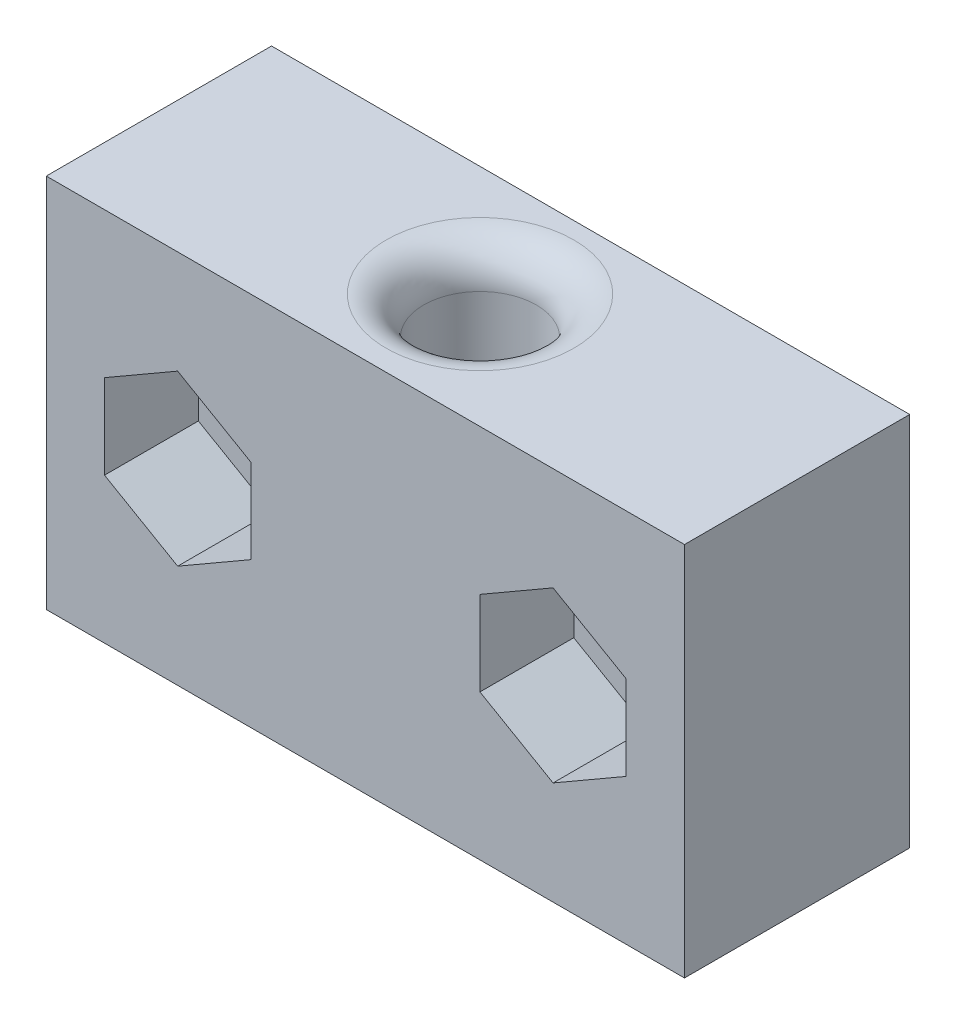
ISO-10303-21;
HEADER;
FILE_DESCRIPTION(('STEP AP214'),'2;1');
FILE_NAME('part.step','',(''),(''),'','','');
FILE_SCHEMA(('AUTOMOTIVE_DESIGN { 1 0 10303 214 1 1 1 1 }'));
ENDSEC;
DATA;
#1=APPLICATION_CONTEXT('core data for automotive mechanical design processes');
#2=APPLICATION_PROTOCOL_DEFINITION('international standard','automotive_design',2000,#1);
#3=PRODUCT_CONTEXT('',#1,'mechanical');
#4=PRODUCT('Part','Part','',(#3));
#5=PRODUCT_RELATED_PRODUCT_CATEGORY('part','',(#4));
#6=PRODUCT_DEFINITION_FORMATION('','',#4);
#7=PRODUCT_DEFINITION_CONTEXT('part definition',#1,'design');
#8=PRODUCT_DEFINITION('design','',#6,#7);
#9=PRODUCT_DEFINITION_SHAPE('','',#8);
#10=(LENGTH_UNIT() NAMED_UNIT(*) SI_UNIT(.MILLI.,.METRE.));
#11=(NAMED_UNIT(*) PLANE_ANGLE_UNIT() SI_UNIT($,.RADIAN.));
#12=(NAMED_UNIT(*) SI_UNIT($,.STERADIAN.) SOLID_ANGLE_UNIT());
#13=UNCERTAINTY_MEASURE_WITH_UNIT(LENGTH_MEASURE(1.E-05),#10,'distance_accuracy_value','');
#14=(GEOMETRIC_REPRESENTATION_CONTEXT(3) GLOBAL_UNCERTAINTY_ASSIGNED_CONTEXT((#13)) GLOBAL_UNIT_ASSIGNED_CONTEXT((#10,
#11,#12)) REPRESENTATION_CONTEXT('',''));
#15=CARTESIAN_POINT('',(0.,0.,0.));
#16=DIRECTION('',(0.,0.,1.));
#17=DIRECTION('',(1.,0.,0.));
#18=AXIS2_PLACEMENT_3D('',#15,#16,#17);
#19=CARTESIAN_POINT('',(9.99999999999315,0.,19.0710678118655));
#20=DIRECTION('',(0.,0.,-1.));
#21=DIRECTION('',(-1.,0.,0.));
#22=AXIS2_PLACEMENT_3D('',#19,#20,#21);
#23=CYLINDRICAL_SURFACE('',#22,2.5);
#24=CARTESIAN_POINT('',(9.99999999999315,0.,2.));
#25=DIRECTION('',(0.,0.,-1.));
#26=DIRECTION('',(-1.,0.,0.));
#27=AXIS2_PLACEMENT_3D('',#24,#25,#26);
#28=CIRCLE('',#27,2.5);
#29=CARTESIAN_POINT('',(7.49999999999315,0.,2.));
#30=VERTEX_POINT('',#29);
#31=EDGE_CURVE('E262',#30,#30,#28,.T.);
#32=ORIENTED_EDGE('',*,*,#31,.T.);
#33=EDGE_LOOP('',(#32));
#34=FACE_BOUND('',#33,.T.);
#35=CARTESIAN_POINT('',(9.99999999999315,0.,7.));
#36=DIRECTION('',(0.,0.,1.));
#37=DIRECTION('',(1.,0.,0.));
#38=AXIS2_PLACEMENT_3D('',#35,#36,#37);
#39=CIRCLE('',#38,2.5);
#40=CARTESIAN_POINT('',(12.4999999999931,0.,7.));
#41=VERTEX_POINT('',#40);
#42=EDGE_CURVE('E38',#41,#41,#39,.F.);
#43=ORIENTED_EDGE('',*,*,#42,.F.);
#44=EDGE_LOOP('',(#43));
#45=FACE_BOUND('',#44,.T.);
#46=ADVANCED_FACE('F34',(#34,#45),#23,.F.);
#47=CARTESIAN_POINT('',(-10.,0.,19.0710678118655));
#48=DIRECTION('',(0.,0.,-1.));
#49=DIRECTION('',(-1.,0.,0.));
#50=AXIS2_PLACEMENT_3D('',#47,#48,#49);
#51=CYLINDRICAL_SURFACE('',#50,2.5);
#52=CARTESIAN_POINT('',(-10.,0.,2.));
#53=DIRECTION('',(0.,0.,-1.));
#54=DIRECTION('',(-1.,0.,0.));
#55=AXIS2_PLACEMENT_3D('',#52,#53,#54);
#56=CIRCLE('',#55,2.5);
#57=CARTESIAN_POINT('',(-12.5,0.,2.));
#58=VERTEX_POINT('',#57);
#59=EDGE_CURVE('E251',#58,#58,#56,.T.);
#60=ORIENTED_EDGE('',*,*,#59,.T.);
#61=EDGE_LOOP('',(#60));
#62=FACE_BOUND('',#61,.T.);
#63=CARTESIAN_POINT('',(-10.,0.,7.));
#64=DIRECTION('',(0.,0.,1.));
#65=DIRECTION('',(1.,0.,0.));
#66=AXIS2_PLACEMENT_3D('',#63,#64,#65);
#67=CIRCLE('',#66,2.5);
#68=CARTESIAN_POINT('',(-7.50000000000001,0.,7.));
#69=VERTEX_POINT('',#68);
#70=EDGE_CURVE('E198',#69,#69,#67,.F.);
#71=ORIENTED_EDGE('',*,*,#70,.F.);
#72=EDGE_LOOP('',(#71));
#73=FACE_BOUND('',#72,.T.);
#74=ADVANCED_FACE('F314',(#62,#73),#51,.F.);
#75=CARTESIAN_POINT('',(17.,-10.,12.));
#76=DIRECTION('',(-1.,0.,0.));
#77=DIRECTION('',(0.,0.,1.));
#78=AXIS2_PLACEMENT_3D('',#75,#76,#77);
#79=PLANE('',#78);
#80=DIRECTION('',(0.,1.,0.));
#81=VECTOR('',#80,1.);
#82=CARTESIAN_POINT('',(17.,-10.,0.));
#83=LINE('',#82,#81);
#84=CARTESIAN_POINT('',(17.,-10.,0.));
#85=VERTEX_POINT('',#84);
#86=CARTESIAN_POINT('',(17.,10.,0.));
#87=VERTEX_POINT('',#86);
#88=EDGE_CURVE('E259',#85,#87,#83,.T.);
#89=ORIENTED_EDGE('',*,*,#88,.T.);
#90=DIRECTION('',(0.,0.,-1.));
#91=VECTOR('',#90,1.);
#92=CARTESIAN_POINT('',(17.,10.,12.));
#93=LINE('',#92,#91);
#94=CARTESIAN_POINT('',(17.,10.,12.));
#95=VERTEX_POINT('',#94);
#96=EDGE_CURVE('E296',#95,#87,#93,.T.);
#97=ORIENTED_EDGE('',*,*,#96,.F.);
#98=DIRECTION('',(0.,1.,0.));
#99=VECTOR('',#98,1.);
#100=CARTESIAN_POINT('',(17.,-10.,12.));
#101=LINE('',#100,#99);
#102=CARTESIAN_POINT('',(17.,-10.,12.));
#103=VERTEX_POINT('',#102);
#104=EDGE_CURVE('E270',#103,#95,#101,.T.);
#105=ORIENTED_EDGE('',*,*,#104,.F.);
#106=DIRECTION('',(0.,0.,-1.));
#107=VECTOR('',#106,1.);
#108=CARTESIAN_POINT('',(17.,-10.,12.));
#109=LINE('',#108,#107);
#110=EDGE_CURVE('E280',#103,#85,#109,.T.);
#111=ORIENTED_EDGE('',*,*,#110,.T.);
#112=EDGE_LOOP('',(#89,#97,#105,#111));
#113=FACE_BOUND('',#112,.T.);
#114=ADVANCED_FACE('F320',(#113),#79,.F.);
#115=CARTESIAN_POINT('',(-17.,10.,12.));
#116=DIRECTION('',(0.,-1.,0.));
#117=DIRECTION('',(0.,0.,-1.));
#118=AXIS2_PLACEMENT_3D('',#115,#116,#117);
#119=PLANE('',#118);
#120=CARTESIAN_POINT('',(0.,10.,5.89249929619027));
#121=DIRECTION('',(0.,-1.,0.));
#122=DIRECTION('',(0.,0.,-1.));
#123=AXIS2_PLACEMENT_3D('',#120,#121,#122);
#124=CIRCLE('',#123,5.);
#125=CARTESIAN_POINT('',(0.,10.,0.892499296190275));
#126=VERTEX_POINT('',#125);
#127=EDGE_CURVE('E43',#126,#126,#124,.T.);
#128=ORIENTED_EDGE('',*,*,#127,.T.);
#129=EDGE_LOOP('',(#128));
#130=FACE_BOUND('',#129,.T.);
#131=DIRECTION('',(-1.,0.,0.));
#132=VECTOR('',#131,1.);
#133=CARTESIAN_POINT('',(-17.,10.,0.));
#134=LINE('',#133,#132);
#135=CARTESIAN_POINT('',(-17.,10.,0.));
#136=VERTEX_POINT('',#135);
#137=EDGE_CURVE('E283',#87,#136,#134,.T.);
#138=ORIENTED_EDGE('',*,*,#137,.T.);
#139=DIRECTION('',(0.,0.,-1.));
#140=VECTOR('',#139,1.);
#141=CARTESIAN_POINT('',(-17.,10.,12.));
#142=LINE('',#141,#140);
#143=CARTESIAN_POINT('',(-17.,10.,12.));
#144=VERTEX_POINT('',#143);
#145=EDGE_CURVE('E293',#144,#136,#142,.T.);
#146=ORIENTED_EDGE('',*,*,#145,.F.);
#147=DIRECTION('',(-1.,0.,0.));
#148=VECTOR('',#147,1.);
#149=CARTESIAN_POINT('',(-17.,10.,12.));
#150=LINE('',#149,#148);
#151=EDGE_CURVE('E273',#95,#144,#150,.T.);
#152=ORIENTED_EDGE('',*,*,#151,.F.);
#153=ORIENTED_EDGE('',*,*,#96,.T.);
#154=EDGE_LOOP('',(#138,#146,#152,#153));
#155=FACE_BOUND('',#154,.T.);
#156=ADVANCED_FACE('F341',(#130,#155),#119,.F.);
#157=CARTESIAN_POINT('',(-17.,-10.,12.));
#158=DIRECTION('',(1.,0.,0.));
#159=DIRECTION('',(0.,0.,-1.));
#160=AXIS2_PLACEMENT_3D('',#157,#158,#159);
#161=PLANE('',#160);
#162=DIRECTION('',(0.,-1.,0.));
#163=VECTOR('',#162,1.);
#164=CARTESIAN_POINT('',(-17.,-10.,0.));
#165=LINE('',#164,#163);
#166=CARTESIAN_POINT('',(-17.,-10.,0.));
#167=VERTEX_POINT('',#166);
#168=EDGE_CURVE('E285',#136,#167,#165,.T.);
#169=ORIENTED_EDGE('',*,*,#168,.T.);
#170=DIRECTION('',(0.,0.,-1.));
#171=VECTOR('',#170,1.);
#172=CARTESIAN_POINT('',(-17.,-10.,12.));
#173=LINE('',#172,#171);
#174=CARTESIAN_POINT('',(-17.,-10.,12.));
#175=VERTEX_POINT('',#174);
#176=EDGE_CURVE('E290',#175,#167,#173,.T.);
#177=ORIENTED_EDGE('',*,*,#176,.F.);
#178=DIRECTION('',(0.,-1.,0.));
#179=VECTOR('',#178,1.);
#180=CARTESIAN_POINT('',(-17.,-10.,12.));
#181=LINE('',#180,#179);
#182=EDGE_CURVE('E276',#144,#175,#181,.T.);
#183=ORIENTED_EDGE('',*,*,#182,.F.);
#184=ORIENTED_EDGE('',*,*,#145,.T.);
#185=EDGE_LOOP('',(#169,#177,#183,#184));
#186=FACE_BOUND('',#185,.T.);
#187=ADVANCED_FACE('F337',(#186),#161,.F.);
#188=CARTESIAN_POINT('',(-17.,-10.,12.));
#189=DIRECTION('',(0.,1.,0.));
#190=DIRECTION('',(0.,0.,1.));
#191=AXIS2_PLACEMENT_3D('',#188,#189,#190);
#192=PLANE('',#191);
#193=CARTESIAN_POINT('',(0.,-10.,5.89249929619027));
#194=DIRECTION('',(0.,1.,0.));
#195=DIRECTION('',(0.,0.,1.));
#196=AXIS2_PLACEMENT_3D('',#193,#194,#195);
#197=CIRCLE('',#196,5.);
#198=CARTESIAN_POINT('',(0.,-10.,10.8924992961903));
#199=VERTEX_POINT('',#198);
#200=EDGE_CURVE('E11',#199,#199,#197,.T.);
#201=ORIENTED_EDGE('',*,*,#200,.T.);
#202=EDGE_LOOP('',(#201));
#203=FACE_BOUND('',#202,.T.);
#204=DIRECTION('',(1.,0.,0.));
#205=VECTOR('',#204,1.);
#206=CARTESIAN_POINT('',(-17.,-10.,0.));
#207=LINE('',#206,#205);
#208=EDGE_CURVE('E274',#167,#85,#207,.T.);
#209=ORIENTED_EDGE('',*,*,#208,.T.);
#210=ORIENTED_EDGE('',*,*,#110,.F.);
#211=DIRECTION('',(1.,0.,0.));
#212=VECTOR('',#211,1.);
#213=CARTESIAN_POINT('',(-17.,-10.,12.));
#214=LINE('',#213,#212);
#215=EDGE_CURVE('E278',#175,#103,#214,.T.);
#216=ORIENTED_EDGE('',*,*,#215,.F.);
#217=ORIENTED_EDGE('',*,*,#176,.T.);
#218=EDGE_LOOP('',(#209,#210,#216,#217));
#219=FACE_BOUND('',#218,.T.);
#220=ADVANCED_FACE('F329',(#203,#219),#192,.F.);
#221=CARTESIAN_POINT('',(0.,0.,12.));
#222=DIRECTION('',(0.,0.,-1.));
#223=DIRECTION('',(-1.,0.,0.));
#224=AXIS2_PLACEMENT_3D('',#221,#222,#223);
#225=PLANE('',#224);
#226=DIRECTION('',(-0.866025403784439,-0.5,0.));
#227=VECTOR('',#226,1.);
#228=CARTESIAN_POINT('',(-10.,4.5,12.));
#229=LINE('',#228,#227);
#230=CARTESIAN_POINT('',(-10.,4.5,12.));
#231=VERTEX_POINT('',#230);
#232=CARTESIAN_POINT('',(-13.89711431703,2.25,12.));
#233=VERTEX_POINT('',#232);
#234=EDGE_CURVE('E185',#231,#233,#229,.T.);
#235=ORIENTED_EDGE('',*,*,#234,.F.);
#236=DIRECTION('',(-0.866025403784439,0.5,0.));
#237=VECTOR('',#236,1.);
#238=CARTESIAN_POINT('',(-6.10288568297003,2.25,12.));
#239=LINE('',#238,#237);
#240=CARTESIAN_POINT('',(-6.10288568297003,2.25,12.));
#241=VERTEX_POINT('',#240);
#242=EDGE_CURVE('E51',#241,#231,#239,.T.);
#243=ORIENTED_EDGE('',*,*,#242,.F.);
#244=DIRECTION('',(0.,1.,0.));
#245=VECTOR('',#244,1.);
#246=CARTESIAN_POINT('',(-6.10288568297003,-2.25,12.));
#247=LINE('',#246,#245);
#248=CARTESIAN_POINT('',(-6.10288568297003,-2.25,12.));
#249=VERTEX_POINT('',#248);
#250=EDGE_CURVE('E171',#249,#241,#247,.T.);
#251=ORIENTED_EDGE('',*,*,#250,.F.);
#252=DIRECTION('',(0.866025403784438,0.5,0.));
#253=VECTOR('',#252,1.);
#254=CARTESIAN_POINT('',(-10.,-4.5,12.));
#255=LINE('',#254,#253);
#256=CARTESIAN_POINT('',(-10.,-4.5,12.));
#257=VERTEX_POINT('',#256);
#258=EDGE_CURVE('E174',#257,#249,#255,.T.);
#259=ORIENTED_EDGE('',*,*,#258,.F.);
#260=DIRECTION('',(0.866025403784439,-0.5,0.));
#261=VECTOR('',#260,1.);
#262=CARTESIAN_POINT('',(-13.89711431703,-2.25,12.));
#263=LINE('',#262,#261);
#264=CARTESIAN_POINT('',(-13.89711431703,-2.25,12.));
#265=VERTEX_POINT('',#264);
#266=EDGE_CURVE('E191',#265,#257,#263,.T.);
#267=ORIENTED_EDGE('',*,*,#266,.F.);
#268=DIRECTION('',(0.,-1.,0.));
#269=VECTOR('',#268,1.);
#270=CARTESIAN_POINT('',(-13.89711431703,2.25,12.));
#271=LINE('',#270,#269);
#272=EDGE_CURVE('E188',#233,#265,#271,.T.);
#273=ORIENTED_EDGE('',*,*,#272,.F.);
#274=EDGE_LOOP('',(#235,#243,#251,#259,#267,#273));
#275=FACE_BOUND('',#274,.T.);
#276=DIRECTION('',(-0.866025403784438,-0.500000000000001,0.));
#277=VECTOR('',#276,1.);
#278=CARTESIAN_POINT('',(9.99999999999315,4.5,12.));
#279=LINE('',#278,#277);
#280=CARTESIAN_POINT('',(9.99999999999315,4.5,12.));
#281=VERTEX_POINT('',#280);
#282=CARTESIAN_POINT('',(6.10288568296317,2.24999999999999,12.));
#283=VERTEX_POINT('',#282);
#284=EDGE_CURVE('E227',#281,#283,#279,.T.);
#285=ORIENTED_EDGE('',*,*,#284,.F.);
#286=DIRECTION('',(-0.866025403784441,0.499999999999995,0.));
#287=VECTOR('',#286,1.);
#288=CARTESIAN_POINT('',(13.8971143170231,2.25000000000004,12.));
#289=LINE('',#288,#287);
#290=CARTESIAN_POINT('',(13.8971143170231,2.25000000000004,12.));
#291=VERTEX_POINT('',#290);
#292=EDGE_CURVE('E59',#291,#281,#289,.T.);
#293=ORIENTED_EDGE('',*,*,#292,.F.);
#294=DIRECTION('',(0.,1.,0.));
#295=VECTOR('',#294,1.);
#296=CARTESIAN_POINT('',(13.8971143170231,-2.24999999999996,12.));
#297=LINE('',#296,#295);
#298=CARTESIAN_POINT('',(13.8971143170231,-2.24999999999996,12.));
#299=VERTEX_POINT('',#298);
#300=EDGE_CURVE('E210',#299,#291,#297,.T.);
#301=ORIENTED_EDGE('',*,*,#300,.F.);
#302=DIRECTION('',(0.866025403784435,0.500000000000007,0.));
#303=VECTOR('',#302,1.);
#304=CARTESIAN_POINT('',(9.99999999999318,-4.5,12.));
#305=LINE('',#304,#303);
#306=CARTESIAN_POINT('',(9.99999999999318,-4.5,12.));
#307=VERTEX_POINT('',#306);
#308=EDGE_CURVE('E236',#307,#299,#305,.T.);
#309=ORIENTED_EDGE('',*,*,#308,.F.);
#310=DIRECTION('',(0.866025403784442,-0.499999999999995,0.));
#311=VECTOR('',#310,1.);
#312=CARTESIAN_POINT('',(6.10288568296318,-2.25000000000002,12.));
#313=LINE('',#312,#311);
#314=CARTESIAN_POINT('',(6.10288568296318,-2.25000000000002,12.));
#315=VERTEX_POINT('',#314);
#316=EDGE_CURVE('E233',#315,#307,#313,.T.);
#317=ORIENTED_EDGE('',*,*,#316,.F.);
#318=DIRECTION('',(0.,-1.,0.));
#319=VECTOR('',#318,1.);
#320=CARTESIAN_POINT('',(6.10288568296317,2.24999999999999,12.));
#321=LINE('',#320,#319);
#322=EDGE_CURVE('E230',#283,#315,#321,.T.);
#323=ORIENTED_EDGE('',*,*,#322,.F.);
#324=EDGE_LOOP('',(#285,#293,#301,#309,#317,#323));
#325=FACE_BOUND('',#324,.T.);
#326=ORIENTED_EDGE('',*,*,#104,.T.);
#327=ORIENTED_EDGE('',*,*,#151,.T.);
#328=ORIENTED_EDGE('',*,*,#182,.T.);
#329=ORIENTED_EDGE('',*,*,#215,.T.);
#330=EDGE_LOOP('',(#326,#327,#328,#329));
#331=FACE_BOUND('',#330,.T.);
#332=ADVANCED_FACE('F325',(#275,#325,#331),#225,.F.);
#333=CARTESIAN_POINT('',(0.,0.,0.));
#334=DIRECTION('',(0.,0.,-1.));
#335=DIRECTION('',(-1.,0.,0.));
#336=AXIS2_PLACEMENT_3D('',#333,#334,#335);
#337=PLANE('',#336);
#338=CARTESIAN_POINT('',(-10.,0.,0.));
#339=DIRECTION('',(0.,0.,-1.));
#340=DIRECTION('',(-1.,0.,0.));
#341=AXIS2_PLACEMENT_3D('',#338,#339,#340);
#342=CIRCLE('',#341,4.3);
#343=CARTESIAN_POINT('',(-14.3,0.,0.));
#344=VERTEX_POINT('',#343);
#345=EDGE_CURVE('E254',#344,#344,#342,.T.);
#346=ORIENTED_EDGE('',*,*,#345,.F.);
#347=EDGE_LOOP('',(#346));
#348=FACE_BOUND('',#347,.T.);
#349=CARTESIAN_POINT('',(9.99999999999315,0.,0.));
#350=DIRECTION('',(0.,0.,-1.));
#351=DIRECTION('',(-1.,0.,0.));
#352=AXIS2_PLACEMENT_3D('',#349,#350,#351);
#353=CIRCLE('',#352,4.3);
#354=CARTESIAN_POINT('',(5.69999999999315,0.,0.));
#355=VERTEX_POINT('',#354);
#356=EDGE_CURVE('E265',#355,#355,#353,.T.);
#357=ORIENTED_EDGE('',*,*,#356,.F.);
#358=EDGE_LOOP('',(#357));
#359=FACE_BOUND('',#358,.T.);
#360=ORIENTED_EDGE('',*,*,#88,.F.);
#361=ORIENTED_EDGE('',*,*,#208,.F.);
#362=ORIENTED_EDGE('',*,*,#168,.F.);
#363=ORIENTED_EDGE('',*,*,#137,.F.);
#364=EDGE_LOOP('',(#360,#361,#362,#363));
#365=FACE_BOUND('',#364,.T.);
#366=ADVANCED_FACE('F328',(#348,#359,#365),#337,.T.);
#367=CARTESIAN_POINT('',(-10.,0.,2.));
#368=DIRECTION('',(0.,0.,-1.));
#369=DIRECTION('',(-1.,0.,0.));
#370=AXIS2_PLACEMENT_3D('',#367,#368,#369);
#371=CYLINDRICAL_SURFACE('',#370,4.3);
#372=CARTESIAN_POINT('',(-10.,0.,2.));
#373=DIRECTION('',(0.,0.,-1.));
#374=DIRECTION('',(-1.,0.,0.));
#375=AXIS2_PLACEMENT_3D('',#372,#373,#374);
#376=CIRCLE('',#375,4.3);
#377=CARTESIAN_POINT('',(-14.3,0.,2.));
#378=VERTEX_POINT('',#377);
#379=EDGE_CURVE('E256',#378,#378,#376,.T.);
#380=ORIENTED_EDGE('',*,*,#379,.F.);
#381=EDGE_LOOP('',(#380));
#382=FACE_BOUND('',#381,.T.);
#383=ORIENTED_EDGE('',*,*,#345,.T.);
#384=EDGE_LOOP('',(#383));
#385=FACE_BOUND('',#384,.T.);
#386=ADVANCED_FACE('F333',(#382,#385),#371,.F.);
#387=CARTESIAN_POINT('',(-10.,0.,2.));
#388=DIRECTION('',(0.,0.,-1.));
#389=DIRECTION('',(-1.,0.,0.));
#390=AXIS2_PLACEMENT_3D('',#387,#388,#389);
#391=PLANE('',#390);
#392=ORIENTED_EDGE('',*,*,#59,.F.);
#393=EDGE_LOOP('',(#392));
#394=FACE_BOUND('',#393,.T.);
#395=ORIENTED_EDGE('',*,*,#379,.T.);
#396=EDGE_LOOP('',(#395));
#397=FACE_BOUND('',#396,.T.);
#398=ADVANCED_FACE('F390',(#394,#397),#391,.T.);
#399=CARTESIAN_POINT('',(9.99999999999315,0.,2.));
#400=DIRECTION('',(0.,0.,-1.));
#401=DIRECTION('',(-1.,0.,0.));
#402=AXIS2_PLACEMENT_3D('',#399,#400,#401);
#403=CYLINDRICAL_SURFACE('',#402,4.3);
#404=CARTESIAN_POINT('',(9.99999999999315,0.,2.));
#405=DIRECTION('',(0.,0.,-1.));
#406=DIRECTION('',(-1.,0.,0.));
#407=AXIS2_PLACEMENT_3D('',#404,#405,#406);
#408=CIRCLE('',#407,4.3);
#409=CARTESIAN_POINT('',(5.69999999999315,0.,2.));
#410=VERTEX_POINT('',#409);
#411=EDGE_CURVE('E255',#410,#410,#408,.T.);
#412=ORIENTED_EDGE('',*,*,#411,.F.);
#413=EDGE_LOOP('',(#412));
#414=FACE_BOUND('',#413,.T.);
#415=ORIENTED_EDGE('',*,*,#356,.T.);
#416=EDGE_LOOP('',(#415));
#417=FACE_BOUND('',#416,.T.);
#418=ADVANCED_FACE('F383',(#414,#417),#403,.F.);
#419=CARTESIAN_POINT('',(9.99999999999315,0.,2.));
#420=DIRECTION('',(0.,0.,-1.));
#421=DIRECTION('',(-1.,0.,0.));
#422=AXIS2_PLACEMENT_3D('',#419,#420,#421);
#423=PLANE('',#422);
#424=ORIENTED_EDGE('',*,*,#31,.F.);
#425=EDGE_LOOP('',(#424));
#426=FACE_BOUND('',#425,.T.);
#427=ORIENTED_EDGE('',*,*,#411,.T.);
#428=EDGE_LOOP('',(#427));
#429=FACE_BOUND('',#428,.T.);
#430=ADVANCED_FACE('F357',(#426,#429),#423,.T.);
#431=CARTESIAN_POINT('',(0.,-18.4852813742386,5.89249929619027));
#432=DIRECTION('',(0.,1.,0.));
#433=DIRECTION('',(0.,0.,1.));
#434=AXIS2_PLACEMENT_3D('',#431,#432,#433);
#435=CYLINDRICAL_SURFACE('',#434,3.);
#436=CARTESIAN_POINT('',(0.,8.,5.89249929619027));
#437=DIRECTION('',(0.,-1.,0.));
#438=DIRECTION('',(0.,0.,-1.));
#439=AXIS2_PLACEMENT_3D('',#436,#437,#438);
#440=CIRCLE('',#439,3.);
#441=CARTESIAN_POINT('',(0.,8.,8.89249929619027));
#442=VERTEX_POINT('',#441);
#443=EDGE_CURVE('E302',#442,#442,#440,.F.);
#444=CARTESIAN_POINT('',(0.,-8.,5.89249929619027));
#445=DIRECTION('',(0.,1.,0.));
#446=DIRECTION('',(0.,0.,1.));
#447=AXIS2_PLACEMENT_3D('',#444,#445,#446);
#448=CIRCLE('',#447,3.);
#449=CARTESIAN_POINT('',(0.,-8.,8.89249929619027));
#450=VERTEX_POINT('',#449);
#451=EDGE_CURVE('E299',#450,#450,#448,.F.);
#452=CARTESIAN_POINT('',(0.,8.,8.89249929619027));
#453=CARTESIAN_POINT('',(0.,7.83333333333333,8.89249929619027));
#454=CARTESIAN_POINT('',(0.,7.66666666666666,8.89249929619027));
#455=CARTESIAN_POINT('',(0.,7.33333333333333,8.89249929619027));
#456=CARTESIAN_POINT('',(0.,7.16666666666666,8.89249929619027));
#457=CARTESIAN_POINT('',(0.,6.83333333333333,8.89249929619027));
#458=CARTESIAN_POINT('',(0.,6.66666666666666,8.89249929619027));
#459=CARTESIAN_POINT('',(0.,6.33333333333333,8.89249929619027));
#460=CARTESIAN_POINT('',(0.,6.16666666666666,8.89249929619027));
#461=CARTESIAN_POINT('',(0.,5.83333333333333,8.89249929619027));
#462=CARTESIAN_POINT('',(0.,5.66666666666666,8.89249929619027));
#463=CARTESIAN_POINT('',(0.,5.33333333333333,8.89249929619027));
#464=CARTESIAN_POINT('',(0.,5.16666666666666,8.89249929619027));
#465=CARTESIAN_POINT('',(0.,4.83333333333333,8.89249929619027));
#466=CARTESIAN_POINT('',(0.,4.66666666666666,8.89249929619027));
#467=CARTESIAN_POINT('',(0.,4.33333333333333,8.89249929619027));
#468=CARTESIAN_POINT('',(0.,4.16666666666666,8.89249929619027));
#469=CARTESIAN_POINT('',(0.,3.83333333333333,8.89249929619027));
#470=CARTESIAN_POINT('',(0.,3.66666666666666,8.89249929619027));
#471=CARTESIAN_POINT('',(0.,3.33333333333333,8.89249929619027));
#472=CARTESIAN_POINT('',(0.,3.16666666666666,8.89249929619027));
#473=CARTESIAN_POINT('',(0.,2.83333333333333,8.89249929619027));
#474=CARTESIAN_POINT('',(0.,2.66666666666666,8.89249929619027));
#475=CARTESIAN_POINT('',(0.,2.33333333333333,8.89249929619027));
#476=CARTESIAN_POINT('',(0.,2.16666666666667,8.89249929619027));
#477=CARTESIAN_POINT('',(0.,1.83333333333333,8.89249929619027));
#478=CARTESIAN_POINT('',(0.,1.66666666666666,8.89249929619027));
#479=CARTESIAN_POINT('',(0.,1.33333333333333,8.89249929619027));
#480=CARTESIAN_POINT('',(0.,1.16666666666666,8.89249929619027));
#481=CARTESIAN_POINT('',(0.,0.833333333333331,8.89249929619027));
#482=CARTESIAN_POINT('',(0.,0.666666666666664,8.89249929619027));
#483=CARTESIAN_POINT('',(0.,0.33333333333333,8.89249929619027));
#484=CARTESIAN_POINT('',(0.,0.166666666666663,8.89249929619027));
#485=CARTESIAN_POINT('',(0.,-0.16666666666667,8.89249929619027));
#486=CARTESIAN_POINT('',(0.,-0.333333333333337,8.89249929619027));
#487=CARTESIAN_POINT('',(0.,-0.666666666666671,8.89249929619027));
#488=CARTESIAN_POINT('',(0.,-0.833333333333338,8.89249929619027));
#489=CARTESIAN_POINT('',(0.,-1.16666666666667,8.89249929619027));
#490=CARTESIAN_POINT('',(0.,-1.33333333333334,8.89249929619027));
#491=CARTESIAN_POINT('',(0.,-1.66666666666667,8.89249929619027));
#492=CARTESIAN_POINT('',(0.,-1.83333333333334,8.89249929619027));
#493=CARTESIAN_POINT('',(0.,-2.16666666666667,8.89249929619027));
#494=CARTESIAN_POINT('',(0.,-2.33333333333334,8.89249929619027));
#495=CARTESIAN_POINT('',(0.,-2.66666666666667,8.89249929619027));
#496=CARTESIAN_POINT('',(0.,-2.83333333333334,8.89249929619027));
#497=CARTESIAN_POINT('',(0.,-3.16666666666667,8.89249929619027));
#498=CARTESIAN_POINT('',(0.,-3.33333333333333,8.89249929619027));
#499=CARTESIAN_POINT('',(0.,-3.66666666666667,8.89249929619027));
#500=CARTESIAN_POINT('',(0.,-3.83333333333333,8.89249929619027));
#501=CARTESIAN_POINT('',(0.,-4.16666666666667,8.89249929619027));
#502=CARTESIAN_POINT('',(0.,-4.33333333333334,8.89249929619027));
#503=CARTESIAN_POINT('',(0.,-4.66666666666667,8.89249929619027));
#504=CARTESIAN_POINT('',(0.,-4.83333333333334,8.89249929619027));
#505=CARTESIAN_POINT('',(0.,-5.16666666666667,8.89249929619027));
#506=CARTESIAN_POINT('',(0.,-5.33333333333333,8.89249929619027));
#507=CARTESIAN_POINT('',(0.,-5.66666666666667,8.89249929619027));
#508=CARTESIAN_POINT('',(0.,-5.83333333333334,8.89249929619027));
#509=CARTESIAN_POINT('',(0.,-6.16666666666667,8.89249929619027));
#510=CARTESIAN_POINT('',(0.,-6.33333333333334,8.89249929619027));
#511=CARTESIAN_POINT('',(0.,-6.66666666666667,8.89249929619027));
#512=CARTESIAN_POINT('',(0.,-6.83333333333333,8.89249929619027));
#513=CARTESIAN_POINT('',(0.,-7.16666666666667,8.89249929619027));
#514=CARTESIAN_POINT('',(0.,-7.33333333333333,8.89249929619027));
#515=CARTESIAN_POINT('',(0.,-7.66666666666667,8.89249929619027));
#516=CARTESIAN_POINT('',(0.,-7.83333333333333,8.89249929619027));
#517=CARTESIAN_POINT('',(0.,-8.,8.89249929619027));
#518=B_SPLINE_CURVE_WITH_KNOTS('',3,(#452,#453,#454,#455,#456,#457,#458,#459,#460,#461,#462,
#463,#464,#465,#466,#467,#468,#469,#470,#471,#472,#473,#474,#475,#476,#477,#478,#479,#480,#481,
#482,#483,#484,#485,#486,#487,#488,#489,#490,#491,#492,#493,#494,#495,#496,#497,#498,#499,#500,
#501,#502,#503,#504,#505,#506,#507,#508,#509,#510,#511,#512,#513,#514,#515,#516,#517),
.UNSPECIFIED.,.F.,.F.,(4,2,2,2,2,2,2,2,2,2,2,2,2,2,2,2,2,2,2,2,2,2,2,2,2,2,2,2,2,2,2,2,4),(0.,
0.5,1.,1.5,2.,2.5,3.,3.5,4.,4.5,5.,5.5,6.,6.5,7.,7.5,8.,8.5,9.,9.5,10.,10.5,11.,11.5,12.,12.5,
13.,13.5,14.,14.5,15.,15.5,16.),.UNSPECIFIED.);
#519=EDGE_CURVE('BSEAM350',#442,#450,#518,.T.);
#520=ORIENTED_EDGE('',*,*,#443,.T.);
#521=ORIENTED_EDGE('',*,*,#451,.T.);
#522=ORIENTED_EDGE('',*,*,#519,.T.);
#523=ORIENTED_EDGE('',*,*,#519,.F.);
#524=EDGE_LOOP('',(#520,#522,#521,#523));
#525=FACE_BOUND('',#524,.T.);
#526=ADVANCED_FACE('F350',(#525),#435,.F.);
#527=CARTESIAN_POINT('',(0.,8.,5.89249929619027));
#528=DIRECTION('',(0.,-1.,0.));
#529=DIRECTION('',(0.,0.,-1.));
#530=AXIS2_PLACEMENT_3D('',#527,#528,#529);
#531=TOROIDAL_SURFACE('',#530,5.,2.);
#532=ORIENTED_EDGE('',*,*,#127,.F.);
#533=EDGE_LOOP('',(#532));
#534=FACE_BOUND('',#533,.T.);
#535=ORIENTED_EDGE('',*,*,#443,.F.);
#536=EDGE_LOOP('',(#535));
#537=FACE_BOUND('',#536,.T.);
#538=ADVANCED_FACE('F348',(#534,#537),#531,.T.);
#539=CARTESIAN_POINT('',(0.,-8.,5.89249929619027));
#540=DIRECTION('',(0.,1.,0.));
#541=DIRECTION('',(0.,0.,1.));
#542=AXIS2_PLACEMENT_3D('',#539,#540,#541);
#543=TOROIDAL_SURFACE('',#542,5.,2.);
#544=ORIENTED_EDGE('',*,*,#200,.F.);
#545=EDGE_LOOP('',(#544));
#546=FACE_BOUND('',#545,.T.);
#547=ORIENTED_EDGE('',*,*,#451,.F.);
#548=EDGE_LOOP('',(#547));
#549=FACE_BOUND('',#548,.T.);
#550=ADVANCED_FACE('F36',(#546,#549),#543,.T.);
#551=CARTESIAN_POINT('',(0.,0.,7.));
#552=DIRECTION('',(0.,0.,1.));
#553=DIRECTION('',(1.,0.,0.));
#554=AXIS2_PLACEMENT_3D('',#551,#552,#553);
#555=PLANE('',#554);
#556=DIRECTION('',(-0.866025403784441,0.499999999999995,0.));
#557=VECTOR('',#556,1.);
#558=CARTESIAN_POINT('',(13.8971143170231,2.25000000000004,7.));
#559=LINE('',#558,#557);
#560=CARTESIAN_POINT('',(13.8971143170231,2.25000000000004,7.));
#561=VERTEX_POINT('',#560);
#562=CARTESIAN_POINT('',(9.99999999999315,4.5,7.));
#563=VERTEX_POINT('',#562);
#564=EDGE_CURVE('E206',#561,#563,#559,.T.);
#565=ORIENTED_EDGE('',*,*,#564,.T.);
#566=DIRECTION('',(-0.866025403784438,-0.500000000000001,0.));
#567=VECTOR('',#566,1.);
#568=CARTESIAN_POINT('',(9.99999999999315,4.5,7.));
#569=LINE('',#568,#567);
#570=CARTESIAN_POINT('',(6.10288568296317,2.24999999999999,7.));
#571=VERTEX_POINT('',#570);
#572=EDGE_CURVE('E209',#563,#571,#569,.T.);
#573=ORIENTED_EDGE('',*,*,#572,.T.);
#574=DIRECTION('',(0.,-1.,0.));
#575=VECTOR('',#574,1.);
#576=CARTESIAN_POINT('',(6.10288568296317,2.24999999999999,7.));
#577=LINE('',#576,#575);
#578=CARTESIAN_POINT('',(6.10288568296318,-2.25000000000002,7.));
#579=VERTEX_POINT('',#578);
#580=EDGE_CURVE('E213',#571,#579,#577,.T.);
#581=ORIENTED_EDGE('',*,*,#580,.T.);
#582=DIRECTION('',(0.866025403784442,-0.499999999999995,0.));
#583=VECTOR('',#582,1.);
#584=CARTESIAN_POINT('',(6.10288568296318,-2.25000000000002,7.));
#585=LINE('',#584,#583);
#586=CARTESIAN_POINT('',(9.99999999999318,-4.5,7.));
#587=VERTEX_POINT('',#586);
#588=EDGE_CURVE('E216',#579,#587,#585,.T.);
#589=ORIENTED_EDGE('',*,*,#588,.T.);
#590=DIRECTION('',(0.866025403784435,0.500000000000007,0.));
#591=VECTOR('',#590,1.);
#592=CARTESIAN_POINT('',(9.99999999999318,-4.5,7.));
#593=LINE('',#592,#591);
#594=CARTESIAN_POINT('',(13.8971143170231,-2.24999999999996,7.));
#595=VERTEX_POINT('',#594);
#596=EDGE_CURVE('E219',#587,#595,#593,.T.);
#597=ORIENTED_EDGE('',*,*,#596,.T.);
#598=DIRECTION('',(0.,1.,0.));
#599=VECTOR('',#598,1.);
#600=CARTESIAN_POINT('',(13.8971143170231,-2.24999999999996,7.));
#601=LINE('',#600,#599);
#602=EDGE_CURVE('E222',#595,#561,#601,.T.);
#603=ORIENTED_EDGE('',*,*,#602,.T.);
#604=EDGE_LOOP('',(#565,#573,#581,#589,#597,#603));
#605=FACE_BOUND('',#604,.T.);
#606=ORIENTED_EDGE('',*,*,#42,.T.);
#607=EDGE_LOOP('',(#606));
#608=FACE_BOUND('',#607,.T.);
#609=ADVANCED_FACE('F311',(#605,#608),#555,.T.);
#610=CARTESIAN_POINT('',(13.8971143170231,2.25000000000004,7.));
#611=DIRECTION('',(0.499999999999995,0.866025403784441,0.));
#612=DIRECTION('',(-0.866025403784441,0.499999999999995,0.));
#613=AXIS2_PLACEMENT_3D('',#610,#611,#612);
#614=PLANE('',#613);
#615=ORIENTED_EDGE('',*,*,#292,.T.);
#616=DIRECTION('',(0.,0.,1.));
#617=VECTOR('',#616,1.);
#618=CARTESIAN_POINT('',(9.99999999999315,4.5,7.));
#619=LINE('',#618,#617);
#620=EDGE_CURVE('E225',#563,#281,#619,.T.);
#621=ORIENTED_EDGE('',*,*,#620,.F.);
#622=ORIENTED_EDGE('',*,*,#564,.F.);
#623=DIRECTION('',(0.,0.,1.));
#624=VECTOR('',#623,1.);
#625=CARTESIAN_POINT('',(13.8971143170231,2.25000000000004,7.));
#626=LINE('',#625,#624);
#627=EDGE_CURVE('E186',#561,#291,#626,.T.);
#628=ORIENTED_EDGE('',*,*,#627,.T.);
#629=EDGE_LOOP('',(#615,#621,#622,#628));
#630=FACE_BOUND('',#629,.T.);
#631=ADVANCED_FACE('F388',(#630),#614,.F.);
#632=CARTESIAN_POINT('',(13.8971143170231,-2.24999999999996,7.));
#633=DIRECTION('',(1.,0.,0.));
#634=DIRECTION('',(0.,1.,0.));
#635=AXIS2_PLACEMENT_3D('',#632,#633,#634);
#636=PLANE('',#635);
#637=ORIENTED_EDGE('',*,*,#300,.T.);
#638=ORIENTED_EDGE('',*,*,#627,.F.);
#639=ORIENTED_EDGE('',*,*,#602,.F.);
#640=DIRECTION('',(0.,0.,1.));
#641=VECTOR('',#640,1.);
#642=CARTESIAN_POINT('',(13.8971143170231,-2.24999999999996,7.));
#643=LINE('',#642,#641);
#644=EDGE_CURVE('E242',#595,#299,#643,.T.);
#645=ORIENTED_EDGE('',*,*,#644,.T.);
#646=EDGE_LOOP('',(#637,#638,#639,#645));
#647=FACE_BOUND('',#646,.T.);
#648=ADVANCED_FACE('F474',(#647),#636,.F.);
#649=CARTESIAN_POINT('',(9.99999999999318,-4.5,7.));
#650=DIRECTION('',(0.500000000000007,-0.866025403784435,0.));
#651=DIRECTION('',(0.866025403784435,0.500000000000007,0.));
#652=AXIS2_PLACEMENT_3D('',#649,#650,#651);
#653=PLANE('',#652);
#654=ORIENTED_EDGE('',*,*,#308,.T.);
#655=ORIENTED_EDGE('',*,*,#644,.F.);
#656=ORIENTED_EDGE('',*,*,#596,.F.);
#657=DIRECTION('',(0.,0.,1.));
#658=VECTOR('',#657,1.);
#659=CARTESIAN_POINT('',(9.99999999999318,-4.5,7.));
#660=LINE('',#659,#658);
#661=EDGE_CURVE('E244',#587,#307,#660,.T.);
#662=ORIENTED_EDGE('',*,*,#661,.T.);
#663=EDGE_LOOP('',(#654,#655,#656,#662));
#664=FACE_BOUND('',#663,.T.);
#665=ADVANCED_FACE('F482',(#664),#653,.F.);
#666=CARTESIAN_POINT('',(6.10288568296318,-2.25000000000002,7.));
#667=DIRECTION('',(-0.499999999999995,-0.866025403784442,0.));
#668=DIRECTION('',(0.866025403784442,-0.499999999999995,0.));
#669=AXIS2_PLACEMENT_3D('',#666,#667,#668);
#670=PLANE('',#669);
#671=ORIENTED_EDGE('',*,*,#316,.T.);
#672=ORIENTED_EDGE('',*,*,#661,.F.);
#673=ORIENTED_EDGE('',*,*,#588,.F.);
#674=DIRECTION('',(0.,0.,1.));
#675=VECTOR('',#674,1.);
#676=CARTESIAN_POINT('',(6.10288568296318,-2.25000000000002,7.));
#677=LINE('',#676,#675);
#678=EDGE_CURVE('E246',#579,#315,#677,.T.);
#679=ORIENTED_EDGE('',*,*,#678,.T.);
#680=EDGE_LOOP('',(#671,#672,#673,#679));
#681=FACE_BOUND('',#680,.T.);
#682=ADVANCED_FACE('F492',(#681),#670,.F.);
#683=CARTESIAN_POINT('',(6.10288568296317,2.24999999999999,7.));
#684=DIRECTION('',(-1.,0.,0.));
#685=DIRECTION('',(0.,-1.,0.));
#686=AXIS2_PLACEMENT_3D('',#683,#684,#685);
#687=PLANE('',#686);
#688=ORIENTED_EDGE('',*,*,#322,.T.);
#689=ORIENTED_EDGE('',*,*,#678,.F.);
#690=ORIENTED_EDGE('',*,*,#580,.F.);
#691=DIRECTION('',(0.,0.,1.));
#692=VECTOR('',#691,1.);
#693=CARTESIAN_POINT('',(6.10288568296317,2.24999999999999,7.));
#694=LINE('',#693,#692);
#695=EDGE_CURVE('E248',#571,#283,#694,.T.);
#696=ORIENTED_EDGE('',*,*,#695,.T.);
#697=EDGE_LOOP('',(#688,#689,#690,#696));
#698=FACE_BOUND('',#697,.T.);
#699=ADVANCED_FACE('F502',(#698),#687,.F.);
#700=CARTESIAN_POINT('',(9.99999999999315,4.5,7.));
#701=DIRECTION('',(-0.500000000000001,0.866025403784438,0.));
#702=DIRECTION('',(-0.866025403784438,-0.500000000000001,0.));
#703=AXIS2_PLACEMENT_3D('',#700,#701,#702);
#704=PLANE('',#703);
#705=ORIENTED_EDGE('',*,*,#284,.T.);
#706=ORIENTED_EDGE('',*,*,#695,.F.);
#707=ORIENTED_EDGE('',*,*,#572,.F.);
#708=ORIENTED_EDGE('',*,*,#620,.T.);
#709=EDGE_LOOP('',(#705,#706,#707,#708));
#710=FACE_BOUND('',#709,.T.);
#711=ADVANCED_FACE('F512',(#710),#704,.F.);
#712=CARTESIAN_POINT('',(0.,0.,7.));
#713=DIRECTION('',(0.,0.,1.));
#714=DIRECTION('',(1.,0.,0.));
#715=AXIS2_PLACEMENT_3D('',#712,#713,#714);
#716=PLANE('',#715);
#717=DIRECTION('',(-0.866025403784439,0.5,0.));
#718=VECTOR('',#717,1.);
#719=CARTESIAN_POINT('',(-6.10288568297003,2.25,7.));
#720=LINE('',#719,#718);
#721=CARTESIAN_POINT('',(-6.10288568297003,2.25,7.));
#722=VERTEX_POINT('',#721);
#723=CARTESIAN_POINT('',(-10.,4.5,7.));
#724=VERTEX_POINT('',#723);
#725=EDGE_CURVE('E151',#722,#724,#720,.T.);
#726=ORIENTED_EDGE('',*,*,#725,.T.);
#727=DIRECTION('',(-0.866025403784439,-0.5,0.));
#728=VECTOR('',#727,1.);
#729=CARTESIAN_POINT('',(-10.,4.5,7.));
#730=LINE('',#729,#728);
#731=CARTESIAN_POINT('',(-13.89711431703,2.25,7.));
#732=VERTEX_POINT('',#731);
#733=EDGE_CURVE('E160',#724,#732,#730,.T.);
#734=ORIENTED_EDGE('',*,*,#733,.T.);
#735=DIRECTION('',(0.,-1.,0.));
#736=VECTOR('',#735,1.);
#737=CARTESIAN_POINT('',(-13.89711431703,2.25,7.));
#738=LINE('',#737,#736);
#739=CARTESIAN_POINT('',(-13.89711431703,-2.25,7.));
#740=VERTEX_POINT('',#739);
#741=EDGE_CURVE('E165',#732,#740,#738,.T.);
#742=ORIENTED_EDGE('',*,*,#741,.T.);
#743=DIRECTION('',(0.866025403784439,-0.5,0.));
#744=VECTOR('',#743,1.);
#745=CARTESIAN_POINT('',(-13.89711431703,-2.25,7.));
#746=LINE('',#745,#744);
#747=CARTESIAN_POINT('',(-10.,-4.5,7.));
#748=VERTEX_POINT('',#747);
#749=EDGE_CURVE('E178',#740,#748,#746,.T.);
#750=ORIENTED_EDGE('',*,*,#749,.T.);
#751=DIRECTION('',(0.866025403784438,0.5,0.));
#752=VECTOR('',#751,1.);
#753=CARTESIAN_POINT('',(-10.,-4.5,7.));
#754=LINE('',#753,#752);
#755=CARTESIAN_POINT('',(-6.10288568297003,-2.25,7.));
#756=VERTEX_POINT('',#755);
#757=EDGE_CURVE('E181',#748,#756,#754,.T.);
#758=ORIENTED_EDGE('',*,*,#757,.T.);
#759=DIRECTION('',(0.,1.,0.));
#760=VECTOR('',#759,1.);
#761=CARTESIAN_POINT('',(-6.10288568297003,-2.25,7.));
#762=LINE('',#761,#760);
#763=EDGE_CURVE('E157',#756,#722,#762,.T.);
#764=ORIENTED_EDGE('',*,*,#763,.T.);
#765=EDGE_LOOP('',(#726,#734,#742,#750,#758,#764));
#766=FACE_BOUND('',#765,.T.);
#767=ORIENTED_EDGE('',*,*,#70,.T.);
#768=EDGE_LOOP('',(#767));
#769=FACE_BOUND('',#768,.T.);
#770=ADVANCED_FACE('F167',(#766,#769),#716,.T.);
#771=CARTESIAN_POINT('',(-6.10288568297003,2.25,7.));
#772=DIRECTION('',(0.5,0.866025403784439,0.));
#773=DIRECTION('',(-0.866025403784439,0.5,0.));
#774=AXIS2_PLACEMENT_3D('',#771,#772,#773);
#775=PLANE('',#774);
#776=ORIENTED_EDGE('',*,*,#242,.T.);
#777=DIRECTION('',(0.,0.,1.));
#778=VECTOR('',#777,1.);
#779=CARTESIAN_POINT('',(-10.,4.5,7.));
#780=LINE('',#779,#778);
#781=EDGE_CURVE('E147',#724,#231,#780,.T.);
#782=ORIENTED_EDGE('',*,*,#781,.F.);
#783=ORIENTED_EDGE('',*,*,#725,.F.);
#784=DIRECTION('',(0.,0.,1.));
#785=VECTOR('',#784,1.);
#786=CARTESIAN_POINT('',(-6.10288568297003,2.25,7.));
#787=LINE('',#786,#785);
#788=EDGE_CURVE('E196',#722,#241,#787,.T.);
#789=ORIENTED_EDGE('',*,*,#788,.T.);
#790=EDGE_LOOP('',(#776,#782,#783,#789));
#791=FACE_BOUND('',#790,.T.);
#792=ADVANCED_FACE('F149',(#791),#775,.F.);
#793=CARTESIAN_POINT('',(-6.10288568297003,-2.25,7.));
#794=DIRECTION('',(1.,0.,0.));
#795=DIRECTION('',(0.,1.,0.));
#796=AXIS2_PLACEMENT_3D('',#793,#794,#795);
#797=PLANE('',#796);
#798=ORIENTED_EDGE('',*,*,#250,.T.);
#799=ORIENTED_EDGE('',*,*,#788,.F.);
#800=ORIENTED_EDGE('',*,*,#763,.F.);
#801=DIRECTION('',(0.,0.,1.));
#802=VECTOR('',#801,1.);
#803=CARTESIAN_POINT('',(-6.10288568297003,-2.25,7.));
#804=LINE('',#803,#802);
#805=EDGE_CURVE('E199',#756,#249,#804,.T.);
#806=ORIENTED_EDGE('',*,*,#805,.T.);
#807=EDGE_LOOP('',(#798,#799,#800,#806));
#808=FACE_BOUND('',#807,.T.);
#809=ADVANCED_FACE('F538',(#808),#797,.F.);
#810=CARTESIAN_POINT('',(-10.,-4.5,7.));
#811=DIRECTION('',(0.5,-0.866025403784439,0.));
#812=DIRECTION('',(0.866025403784439,0.5,0.));
#813=AXIS2_PLACEMENT_3D('',#810,#811,#812);
#814=PLANE('',#813);
#815=ORIENTED_EDGE('',*,*,#258,.T.);
#816=ORIENTED_EDGE('',*,*,#805,.F.);
#817=ORIENTED_EDGE('',*,*,#757,.F.);
#818=DIRECTION('',(0.,0.,1.));
#819=VECTOR('',#818,1.);
#820=CARTESIAN_POINT('',(-10.,-4.5,7.));
#821=LINE('',#820,#819);
#822=EDGE_CURVE('E201',#748,#257,#821,.T.);
#823=ORIENTED_EDGE('',*,*,#822,.T.);
#824=EDGE_LOOP('',(#815,#816,#817,#823));
#825=FACE_BOUND('',#824,.T.);
#826=ADVANCED_FACE('F547',(#825),#814,.F.);
#827=CARTESIAN_POINT('',(-13.89711431703,-2.25,7.));
#828=DIRECTION('',(-0.5,-0.866025403784439,0.));
#829=DIRECTION('',(0.866025403784439,-0.5,0.));
#830=AXIS2_PLACEMENT_3D('',#827,#828,#829);
#831=PLANE('',#830);
#832=ORIENTED_EDGE('',*,*,#266,.T.);
#833=ORIENTED_EDGE('',*,*,#822,.F.);
#834=ORIENTED_EDGE('',*,*,#749,.F.);
#835=DIRECTION('',(0.,0.,1.));
#836=VECTOR('',#835,1.);
#837=CARTESIAN_POINT('',(-13.89711431703,-2.25,7.));
#838=LINE('',#837,#836);
#839=EDGE_CURVE('E203',#740,#265,#838,.T.);
#840=ORIENTED_EDGE('',*,*,#839,.T.);
#841=EDGE_LOOP('',(#832,#833,#834,#840));
#842=FACE_BOUND('',#841,.T.);
#843=ADVANCED_FACE('F557',(#842),#831,.F.);
#844=CARTESIAN_POINT('',(-13.89711431703,2.25,7.));
#845=DIRECTION('',(-1.,0.,0.));
#846=DIRECTION('',(0.,-1.,0.));
#847=AXIS2_PLACEMENT_3D('',#844,#845,#846);
#848=PLANE('',#847);
#849=ORIENTED_EDGE('',*,*,#272,.T.);
#850=ORIENTED_EDGE('',*,*,#839,.F.);
#851=ORIENTED_EDGE('',*,*,#741,.F.);
#852=DIRECTION('',(0.,0.,1.));
#853=VECTOR('',#852,1.);
#854=CARTESIAN_POINT('',(-13.89711431703,2.25,7.));
#855=LINE('',#854,#853);
#856=EDGE_CURVE('E156',#732,#233,#855,.T.);
#857=ORIENTED_EDGE('',*,*,#856,.T.);
#858=EDGE_LOOP('',(#849,#850,#851,#857));
#859=FACE_BOUND('',#858,.T.);
#860=ADVANCED_FACE('F567',(#859),#848,.F.);
#861=CARTESIAN_POINT('',(-10.,4.5,7.));
#862=DIRECTION('',(-0.5,0.866025403784439,0.));
#863=DIRECTION('',(-0.866025403784439,-0.5,0.));
#864=AXIS2_PLACEMENT_3D('',#861,#862,#863);
#865=PLANE('',#864);
#866=ORIENTED_EDGE('',*,*,#234,.T.);
#867=ORIENTED_EDGE('',*,*,#856,.F.);
#868=ORIENTED_EDGE('',*,*,#733,.F.);
#869=ORIENTED_EDGE('',*,*,#781,.T.);
#870=EDGE_LOOP('',(#866,#867,#868,#869));
#871=FACE_BOUND('',#870,.T.);
#872=ADVANCED_FACE('F161',(#871),#865,.F.);
#873=CLOSED_SHELL('',(#46,#74,#114,#156,#187,#220,#332,#366,#386,#398,#418,#430,#526,#538,#550,
#609,#631,#648,#665,#682,#699,#711,#770,#792,#809,#826,#843,#860,#872));
#874=MANIFOLD_SOLID_BREP('B2',#873);
#875=ADVANCED_BREP_SHAPE_REPRESENTATION('',(#18,#874),#14);
#876=SHAPE_DEFINITION_REPRESENTATION(#9,#875);
ENDSEC;
END-ISO-10303-21;
